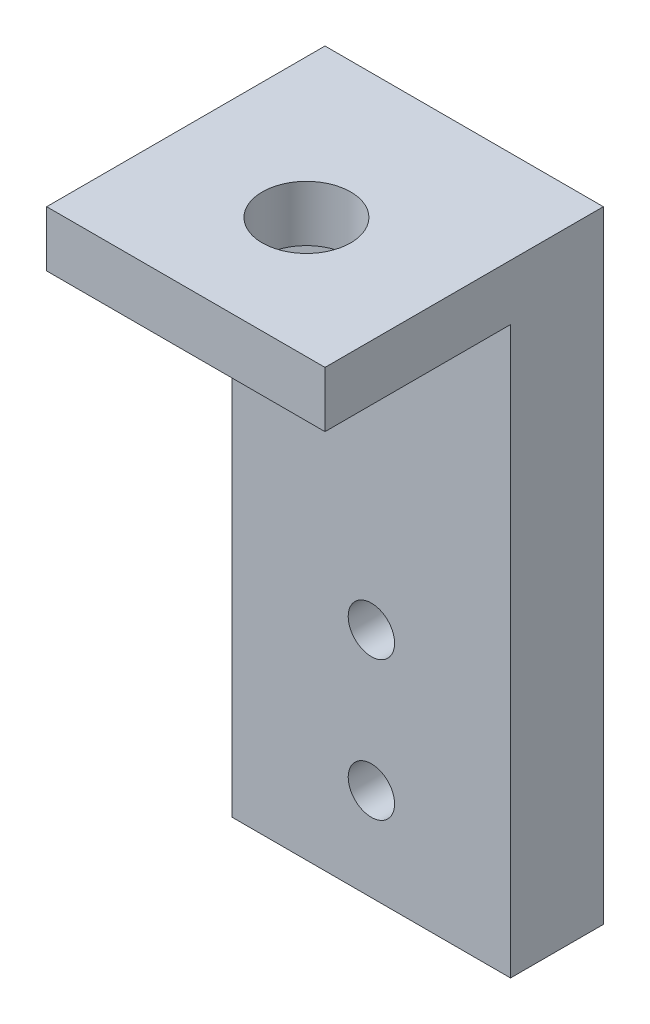
ISO-10303-21;
HEADER;
FILE_DESCRIPTION(('STEP AP214'),'2;1');
FILE_NAME('part.step','',(''),(''),'','','');
FILE_SCHEMA(('AUTOMOTIVE_DESIGN { 1 0 10303 214 1 1 1 1 }'));
ENDSEC;
DATA;
#1=APPLICATION_CONTEXT('core data for automotive mechanical design processes');
#2=APPLICATION_PROTOCOL_DEFINITION('international standard','automotive_design',2000,#1);
#3=PRODUCT_CONTEXT('',#1,'mechanical');
#4=PRODUCT('Part','Part','',(#3));
#5=PRODUCT_RELATED_PRODUCT_CATEGORY('part','',(#4));
#6=PRODUCT_DEFINITION_FORMATION('','',#4);
#7=PRODUCT_DEFINITION_CONTEXT('part definition',#1,'design');
#8=PRODUCT_DEFINITION('design','',#6,#7);
#9=PRODUCT_DEFINITION_SHAPE('','',#8);
#10=(LENGTH_UNIT() NAMED_UNIT(*) SI_UNIT(.MILLI.,.METRE.));
#11=(NAMED_UNIT(*) PLANE_ANGLE_UNIT() SI_UNIT($,.RADIAN.));
#12=(NAMED_UNIT(*) SI_UNIT($,.STERADIAN.) SOLID_ANGLE_UNIT());
#13=UNCERTAINTY_MEASURE_WITH_UNIT(LENGTH_MEASURE(1.E-05),#10,'distance_accuracy_value','');
#14=(GEOMETRIC_REPRESENTATION_CONTEXT(3) GLOBAL_UNCERTAINTY_ASSIGNED_CONTEXT((#13)) GLOBAL_UNIT_ASSIGNED_CONTEXT((#10,
#11,#12)) REPRESENTATION_CONTEXT('',''));
#15=CARTESIAN_POINT('',(0.,0.,0.));
#16=DIRECTION('',(0.,0.,1.));
#17=DIRECTION('',(1.,0.,0.));
#18=AXIS2_PLACEMENT_3D('',#15,#16,#17);
#19=CARTESIAN_POINT('',(-15.,33.5,10.));
#20=DIRECTION('',(1.,0.,0.));
#21=DIRECTION('',(0.,1.,0.));
#22=AXIS2_PLACEMENT_3D('',#19,#20,#21);
#23=PLANE('',#22);
#24=DIRECTION('',(0.,-1.,0.));
#25=VECTOR('',#24,1.);
#26=CARTESIAN_POINT('',(-15.,33.5,0.));
#27=LINE('',#26,#25);
#28=CARTESIAN_POINT('',(-15.,33.5,0.));
#29=VERTEX_POINT('',#28);
#30=CARTESIAN_POINT('',(-15.,-33.5,0.));
#31=VERTEX_POINT('',#30);
#32=EDGE_CURVE('E91',#29,#31,#27,.T.);
#33=ORIENTED_EDGE('',*,*,#32,.T.);
#34=DIRECTION('',(0.,0.,-1.));
#35=VECTOR('',#34,1.);
#36=CARTESIAN_POINT('',(-15.,-33.5,10.));
#37=LINE('',#36,#35);
#38=CARTESIAN_POINT('',(-15.,-33.5,10.));
#39=VERTEX_POINT('',#38);
#40=EDGE_CURVE('E11',#39,#31,#37,.T.);
#41=ORIENTED_EDGE('',*,*,#40,.F.);
#42=DIRECTION('',(0.,-1.,0.));
#43=VECTOR('',#42,1.);
#44=CARTESIAN_POINT('',(-15.,33.5,10.));
#45=LINE('',#44,#43);
#46=CARTESIAN_POINT('',(-15.,27.5,10.));
#47=VERTEX_POINT('',#46);
#48=EDGE_CURVE('E84',#47,#39,#45,.T.);
#49=ORIENTED_EDGE('',*,*,#48,.F.);
#50=DIRECTION('',(0.,0.,-1.));
#51=VECTOR('',#50,1.);
#52=CARTESIAN_POINT('',(-15.,27.5,30.));
#53=LINE('',#52,#51);
#54=CARTESIAN_POINT('',(-15.,27.5,30.));
#55=VERTEX_POINT('',#54);
#56=EDGE_CURVE('E99',#55,#47,#53,.T.);
#57=ORIENTED_EDGE('',*,*,#56,.F.);
#58=DIRECTION('',(0.,-1.,0.));
#59=VECTOR('',#58,1.);
#60=CARTESIAN_POINT('',(-15.,33.5,30.));
#61=LINE('',#60,#59);
#62=CARTESIAN_POINT('',(-15.,33.5,30.));
#63=VERTEX_POINT('',#62);
#64=EDGE_CURVE('E94',#63,#55,#61,.T.);
#65=ORIENTED_EDGE('',*,*,#64,.F.);
#66=DIRECTION('',(0.,0.,-1.));
#67=VECTOR('',#66,1.);
#68=CARTESIAN_POINT('',(-15.,33.5,10.));
#69=LINE('',#68,#67);
#70=EDGE_CURVE('E77',#63,#29,#69,.T.);
#71=ORIENTED_EDGE('',*,*,#70,.T.);
#72=EDGE_LOOP('',(#33,#41,#49,#57,#65,#71));
#73=FACE_BOUND('',#72,.T.);
#74=ADVANCED_FACE('F31',(#73),#23,.F.);
#75=CARTESIAN_POINT('',(-15.,-33.5,10.));
#76=DIRECTION('',(0.,1.,0.));
#77=DIRECTION('',(0.,0.,1.));
#78=AXIS2_PLACEMENT_3D('',#75,#76,#77);
#79=PLANE('',#78);
#80=DIRECTION('',(1.,0.,0.));
#81=VECTOR('',#80,1.);
#82=CARTESIAN_POINT('',(-15.,-33.5,0.));
#83=LINE('',#82,#81);
#84=CARTESIAN_POINT('',(15.,-33.5,0.));
#85=VERTEX_POINT('',#84);
#86=EDGE_CURVE('E98',#31,#85,#83,.T.);
#87=ORIENTED_EDGE('',*,*,#86,.T.);
#88=DIRECTION('',(0.,0.,-1.));
#89=VECTOR('',#88,1.);
#90=CARTESIAN_POINT('',(15.,-33.5,10.));
#91=LINE('',#90,#89);
#92=CARTESIAN_POINT('',(15.,-33.5,10.));
#93=VERTEX_POINT('',#92);
#94=EDGE_CURVE('E39',#93,#85,#91,.T.);
#95=ORIENTED_EDGE('',*,*,#94,.F.);
#96=DIRECTION('',(1.,0.,0.));
#97=VECTOR('',#96,1.);
#98=CARTESIAN_POINT('',(-15.,-33.5,10.));
#99=LINE('',#98,#97);
#100=EDGE_CURVE('E53',#39,#93,#99,.T.);
#101=ORIENTED_EDGE('',*,*,#100,.F.);
#102=ORIENTED_EDGE('',*,*,#40,.T.);
#103=EDGE_LOOP('',(#87,#95,#101,#102));
#104=FACE_BOUND('',#103,.T.);
#105=ADVANCED_FACE('F190',(#104),#79,.F.);
#106=CARTESIAN_POINT('',(15.,33.5,10.));
#107=DIRECTION('',(-1.,0.,0.));
#108=DIRECTION('',(0.,-1.,0.));
#109=AXIS2_PLACEMENT_3D('',#106,#107,#108);
#110=PLANE('',#109);
#111=DIRECTION('',(0.,1.,0.));
#112=VECTOR('',#111,1.);
#113=CARTESIAN_POINT('',(15.,33.5,0.));
#114=LINE('',#113,#112);
#115=CARTESIAN_POINT('',(15.,33.5,0.));
#116=VERTEX_POINT('',#115);
#117=EDGE_CURVE('E85',#85,#116,#114,.T.);
#118=ORIENTED_EDGE('',*,*,#117,.T.);
#119=DIRECTION('',(0.,0.,-1.));
#120=VECTOR('',#119,1.);
#121=CARTESIAN_POINT('',(15.,33.5,10.));
#122=LINE('',#121,#120);
#123=CARTESIAN_POINT('',(15.,33.5,30.));
#124=VERTEX_POINT('',#123);
#125=EDGE_CURVE('E80',#124,#116,#122,.T.);
#126=ORIENTED_EDGE('',*,*,#125,.F.);
#127=DIRECTION('',(0.,1.,0.));
#128=VECTOR('',#127,1.);
#129=CARTESIAN_POINT('',(15.,33.5,30.));
#130=LINE('',#129,#128);
#131=CARTESIAN_POINT('',(15.,27.5,30.));
#132=VERTEX_POINT('',#131);
#133=EDGE_CURVE('E134',#132,#124,#130,.T.);
#134=ORIENTED_EDGE('',*,*,#133,.F.);
#135=DIRECTION('',(0.,0.,-1.));
#136=VECTOR('',#135,1.);
#137=CARTESIAN_POINT('',(15.,27.5,30.));
#138=LINE('',#137,#136);
#139=CARTESIAN_POINT('',(15.,27.5,10.));
#140=VERTEX_POINT('',#139);
#141=EDGE_CURVE('E103',#132,#140,#138,.T.);
#142=ORIENTED_EDGE('',*,*,#141,.T.);
#143=DIRECTION('',(0.,1.,0.));
#144=VECTOR('',#143,1.);
#145=CARTESIAN_POINT('',(15.,33.5,10.));
#146=LINE('',#145,#144);
#147=EDGE_CURVE('E95',#93,#140,#146,.T.);
#148=ORIENTED_EDGE('',*,*,#147,.F.);
#149=ORIENTED_EDGE('',*,*,#94,.T.);
#150=EDGE_LOOP('',(#118,#126,#134,#142,#148,#149));
#151=FACE_BOUND('',#150,.T.);
#152=ADVANCED_FACE('F132',(#151),#110,.F.);
#153=CARTESIAN_POINT('',(-15.,33.5,10.));
#154=DIRECTION('',(0.,-1.,0.));
#155=DIRECTION('',(0.,0.,-1.));
#156=AXIS2_PLACEMENT_3D('',#153,#154,#155);
#157=PLANE('',#156);
#158=CARTESIAN_POINT('',(0.,33.5,17.));
#159=DIRECTION('',(0.,1.,0.));
#160=DIRECTION('',(0.,0.,1.));
#161=AXIS2_PLACEMENT_3D('',#158,#159,#160);
#162=CIRCLE('',#161,4.765);
#163=CARTESIAN_POINT('',(0.,33.5,21.765));
#164=VERTEX_POINT('',#163);
#165=EDGE_CURVE('E148',#164,#164,#162,.T.);
#166=ORIENTED_EDGE('',*,*,#165,.F.);
#167=EDGE_LOOP('',(#166));
#168=FACE_BOUND('',#167,.T.);
#169=DIRECTION('',(-1.,0.,0.));
#170=VECTOR('',#169,1.);
#171=CARTESIAN_POINT('',(-15.,33.5,0.));
#172=LINE('',#171,#170);
#173=EDGE_CURVE('E73',#116,#29,#172,.T.);
#174=ORIENTED_EDGE('',*,*,#173,.T.);
#175=ORIENTED_EDGE('',*,*,#70,.F.);
#176=DIRECTION('',(-1.,0.,0.));
#177=VECTOR('',#176,1.);
#178=CARTESIAN_POINT('',(-15.,33.5,30.));
#179=LINE('',#178,#177);
#180=EDGE_CURVE('E135',#124,#63,#179,.T.);
#181=ORIENTED_EDGE('',*,*,#180,.F.);
#182=ORIENTED_EDGE('',*,*,#125,.T.);
#183=EDGE_LOOP('',(#174,#175,#181,#182));
#184=FACE_BOUND('',#183,.T.);
#185=ADVANCED_FACE('F75',(#168,#184),#157,.F.);
#186=CARTESIAN_POINT('',(-15.,-33.5,10.));
#187=DIRECTION('',(0.,0.,1.));
#188=DIRECTION('',(1.,0.,0.));
#189=AXIS2_PLACEMENT_3D('',#186,#187,#188);
#190=PLANE('',#189);
#191=CARTESIAN_POINT('',(0.,-8.5,10.));
#192=DIRECTION('',(0.,0.,-1.));
#193=DIRECTION('',(-1.,0.,0.));
#194=AXIS2_PLACEMENT_3D('',#191,#192,#193);
#195=CIRCLE('',#194,2.5);
#196=CARTESIAN_POINT('',(-2.50000000000001,-8.5,10.));
#197=VERTEX_POINT('',#196);
#198=EDGE_CURVE('E155',#197,#197,#195,.T.);
#199=ORIENTED_EDGE('',*,*,#198,.T.);
#200=EDGE_LOOP('',(#199));
#201=FACE_BOUND('',#200,.T.);
#202=CARTESIAN_POINT('',(0.,-23.5,10.));
#203=DIRECTION('',(0.,0.,-1.));
#204=DIRECTION('',(-1.,0.,0.));
#205=AXIS2_PLACEMENT_3D('',#202,#203,#204);
#206=CIRCLE('',#205,2.5);
#207=CARTESIAN_POINT('',(-2.50000000000001,-23.5,10.));
#208=VERTEX_POINT('',#207);
#209=EDGE_CURVE('E151',#208,#208,#206,.T.);
#210=ORIENTED_EDGE('',*,*,#209,.T.);
#211=EDGE_LOOP('',(#210));
#212=FACE_BOUND('',#211,.T.);
#213=DIRECTION('',(1.,0.,0.));
#214=VECTOR('',#213,1.);
#215=CARTESIAN_POINT('',(-15.,27.5,10.));
#216=LINE('',#215,#214);
#217=EDGE_CURVE('E47',#47,#140,#216,.T.);
#218=ORIENTED_EDGE('',*,*,#217,.F.);
#219=ORIENTED_EDGE('',*,*,#48,.T.);
#220=ORIENTED_EDGE('',*,*,#100,.T.);
#221=ORIENTED_EDGE('',*,*,#147,.T.);
#222=EDGE_LOOP('',(#218,#219,#220,#221));
#223=FACE_BOUND('',#222,.T.);
#224=ADVANCED_FACE('F121',(#201,#212,#223),#190,.T.);
#225=CARTESIAN_POINT('',(-15.,-33.5,0.));
#226=DIRECTION('',(0.,0.,1.));
#227=DIRECTION('',(1.,0.,0.));
#228=AXIS2_PLACEMENT_3D('',#225,#226,#227);
#229=PLANE('',#228);
#230=CARTESIAN_POINT('',(0.,-8.5,0.));
#231=DIRECTION('',(0.,0.,-1.));
#232=DIRECTION('',(-1.,0.,0.));
#233=AXIS2_PLACEMENT_3D('',#230,#231,#232);
#234=CIRCLE('',#233,2.5);
#235=CARTESIAN_POINT('',(-2.50000000000001,-8.5,0.));
#236=VERTEX_POINT('',#235);
#237=EDGE_CURVE('E158',#236,#236,#234,.T.);
#238=ORIENTED_EDGE('',*,*,#237,.F.);
#239=EDGE_LOOP('',(#238));
#240=FACE_BOUND('',#239,.T.);
#241=CARTESIAN_POINT('',(0.,-23.5,0.));
#242=DIRECTION('',(0.,0.,-1.));
#243=DIRECTION('',(-1.,0.,0.));
#244=AXIS2_PLACEMENT_3D('',#241,#242,#243);
#245=CIRCLE('',#244,2.5);
#246=CARTESIAN_POINT('',(-2.50000000000001,-23.5,0.));
#247=VERTEX_POINT('',#246);
#248=EDGE_CURVE('E152',#247,#247,#245,.T.);
#249=ORIENTED_EDGE('',*,*,#248,.F.);
#250=EDGE_LOOP('',(#249));
#251=FACE_BOUND('',#250,.T.);
#252=ORIENTED_EDGE('',*,*,#32,.F.);
#253=ORIENTED_EDGE('',*,*,#173,.F.);
#254=ORIENTED_EDGE('',*,*,#117,.F.);
#255=ORIENTED_EDGE('',*,*,#86,.F.);
#256=EDGE_LOOP('',(#252,#253,#254,#255));
#257=FACE_BOUND('',#256,.T.);
#258=ADVANCED_FACE('F97',(#240,#251,#257),#229,.F.);
#259=CARTESIAN_POINT('',(-15.,27.5,30.));
#260=DIRECTION('',(0.,1.,0.));
#261=DIRECTION('',(0.,0.,1.));
#262=AXIS2_PLACEMENT_3D('',#259,#260,#261);
#263=PLANE('',#262);
#264=CARTESIAN_POINT('',(0.,27.5,17.));
#265=DIRECTION('',(0.,1.,0.));
#266=DIRECTION('',(0.,0.,1.));
#267=AXIS2_PLACEMENT_3D('',#264,#265,#266);
#268=CIRCLE('',#267,4.765);
#269=CARTESIAN_POINT('',(0.,27.5,21.765));
#270=VERTEX_POINT('',#269);
#271=EDGE_CURVE('E131',#270,#270,#268,.F.);
#272=ORIENTED_EDGE('',*,*,#271,.F.);
#273=EDGE_LOOP('',(#272));
#274=FACE_BOUND('',#273,.T.);
#275=ORIENTED_EDGE('',*,*,#217,.T.);
#276=ORIENTED_EDGE('',*,*,#141,.F.);
#277=DIRECTION('',(1.,0.,0.));
#278=VECTOR('',#277,1.);
#279=CARTESIAN_POINT('',(-15.,27.5,30.));
#280=LINE('',#279,#278);
#281=EDGE_CURVE('E140',#55,#132,#280,.T.);
#282=ORIENTED_EDGE('',*,*,#281,.F.);
#283=ORIENTED_EDGE('',*,*,#56,.T.);
#284=EDGE_LOOP('',(#275,#276,#282,#283));
#285=FACE_BOUND('',#284,.T.);
#286=ADVANCED_FACE('F127',(#274,#285),#263,.F.);
#287=CARTESIAN_POINT('',(-15.,27.5,30.));
#288=DIRECTION('',(0.,0.,1.));
#289=DIRECTION('',(1.,0.,0.));
#290=AXIS2_PLACEMENT_3D('',#287,#288,#289);
#291=PLANE('',#290);
#292=ORIENTED_EDGE('',*,*,#64,.T.);
#293=ORIENTED_EDGE('',*,*,#281,.T.);
#294=ORIENTED_EDGE('',*,*,#133,.T.);
#295=ORIENTED_EDGE('',*,*,#180,.T.);
#296=EDGE_LOOP('',(#292,#293,#294,#295));
#297=FACE_BOUND('',#296,.T.);
#298=ADVANCED_FACE('F185',(#297),#291,.T.);
#299=CARTESIAN_POINT('',(0.,-33.501025,17.));
#300=DIRECTION('',(0.,1.,0.));
#301=DIRECTION('',(0.,0.,1.));
#302=AXIS2_PLACEMENT_3D('',#299,#300,#301);
#303=CYLINDRICAL_SURFACE('',#302,4.765);
#304=ORIENTED_EDGE('',*,*,#165,.T.);
#305=EDGE_LOOP('',(#304));
#306=FACE_BOUND('',#305,.T.);
#307=ORIENTED_EDGE('',*,*,#271,.T.);
#308=EDGE_LOOP('',(#307));
#309=FACE_BOUND('',#308,.T.);
#310=ADVANCED_FACE('F179',(#306,#309),#303,.F.);
#311=CARTESIAN_POINT('',(0.,-23.5,10.));
#312=DIRECTION('',(0.,0.,-1.));
#313=DIRECTION('',(-1.,0.,0.));
#314=AXIS2_PLACEMENT_3D('',#311,#312,#313);
#315=CYLINDRICAL_SURFACE('',#314,2.5);
#316=ORIENTED_EDGE('',*,*,#209,.F.);
#317=EDGE_LOOP('',(#316));
#318=FACE_BOUND('',#317,.T.);
#319=ORIENTED_EDGE('',*,*,#248,.T.);
#320=EDGE_LOOP('',(#319));
#321=FACE_BOUND('',#320,.T.);
#322=ADVANCED_FACE('F169',(#318,#321),#315,.F.);
#323=CARTESIAN_POINT('',(0.,-8.5,10.));
#324=DIRECTION('',(0.,0.,-1.));
#325=DIRECTION('',(-1.,0.,0.));
#326=AXIS2_PLACEMENT_3D('',#323,#324,#325);
#327=CYLINDRICAL_SURFACE('',#326,2.5);
#328=ORIENTED_EDGE('',*,*,#198,.F.);
#329=EDGE_LOOP('',(#328));
#330=FACE_BOUND('',#329,.T.);
#331=ORIENTED_EDGE('',*,*,#237,.T.);
#332=EDGE_LOOP('',(#331));
#333=FACE_BOUND('',#332,.T.);
#334=ADVANCED_FACE('F166',(#330,#333),#327,.F.);
#335=CLOSED_SHELL('',(#74,#105,#152,#185,#224,#258,#286,#298,#310,#322,#334));
#336=MANIFOLD_SOLID_BREP('B2',#335);
#337=ADVANCED_BREP_SHAPE_REPRESENTATION('',(#18,#336),#14);
#338=SHAPE_DEFINITION_REPRESENTATION(#9,#337);
ENDSEC;
END-ISO-10303-21;
